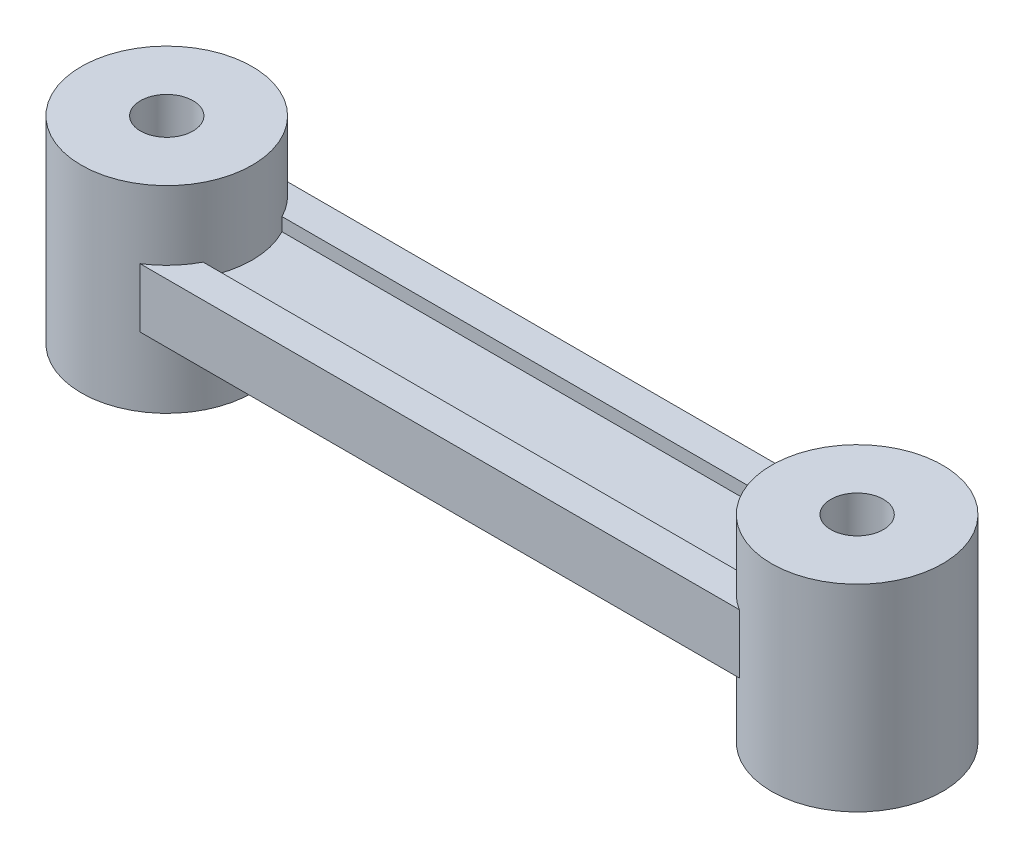
ISO-10303-21;
HEADER;
FILE_DESCRIPTION(('STEP AP214'),'2;1');
FILE_NAME('part.step','',(''),(''),'','','');
FILE_SCHEMA(('AUTOMOTIVE_DESIGN { 1 0 10303 214 1 1 1 1 }'));
ENDSEC;
DATA;
#1=APPLICATION_CONTEXT('core data for automotive mechanical design processes');
#2=APPLICATION_PROTOCOL_DEFINITION('international standard','automotive_design',2000,#1);
#3=PRODUCT_CONTEXT('',#1,'mechanical');
#4=PRODUCT('Part','Part','',(#3));
#5=PRODUCT_RELATED_PRODUCT_CATEGORY('part','',(#4));
#6=PRODUCT_DEFINITION_FORMATION('','',#4);
#7=PRODUCT_DEFINITION_CONTEXT('part definition',#1,'design');
#8=PRODUCT_DEFINITION('design','',#6,#7);
#9=PRODUCT_DEFINITION_SHAPE('','',#8);
#10=(LENGTH_UNIT() NAMED_UNIT(*) SI_UNIT(.MILLI.,.METRE.));
#11=(NAMED_UNIT(*) PLANE_ANGLE_UNIT() SI_UNIT($,.RADIAN.));
#12=(NAMED_UNIT(*) SI_UNIT($,.STERADIAN.) SOLID_ANGLE_UNIT());
#13=UNCERTAINTY_MEASURE_WITH_UNIT(LENGTH_MEASURE(1.E-05),#10,'distance_accuracy_value','');
#14=(GEOMETRIC_REPRESENTATION_CONTEXT(3) GLOBAL_UNCERTAINTY_ASSIGNED_CONTEXT((#13)) GLOBAL_UNIT_ASSIGNED_CONTEXT((#10,
#11,#12)) REPRESENTATION_CONTEXT('',''));
#15=CARTESIAN_POINT('',(0.,0.,0.));
#16=DIRECTION('',(0.,0.,1.));
#17=DIRECTION('',(1.,0.,0.));
#18=AXIS2_PLACEMENT_3D('',#15,#16,#17);
#19=CARTESIAN_POINT('',(-13.,-4.5,0.));
#20=DIRECTION('',(0.,1.,0.));
#21=DIRECTION('',(0.,0.,1.));
#22=AXIS2_PLACEMENT_3D('',#19,#20,#21);
#23=PLANE('',#22);
#24=DIRECTION('',(-1.,0.,0.));
#25=VECTOR('',#24,1.);
#26=CARTESIAN_POINT('',(-106.467437405329,-4.5,-6.));
#27=LINE('',#26,#25);
#28=CARTESIAN_POINT('',(-24.5325625946708,-4.5,-6.));
#29=VERTEX_POINT('',#28);
#30=CARTESIAN_POINT('',(-106.467437405329,-4.5,-6.));
#31=VERTEX_POINT('',#30);
#32=EDGE_CURVE('E149',#29,#31,#27,.T.);
#33=ORIENTED_EDGE('',*,*,#32,.T.);
#34=CARTESIAN_POINT('',(-118.,-4.5,0.));
#35=DIRECTION('',(0.,-1.,0.));
#36=DIRECTION('',(0.,0.,1.));
#37=AXIS2_PLACEMENT_3D('',#34,#35,#36);
#38=CIRCLE('',#37,13.);
#39=CARTESIAN_POINT('',(-111.071796769725,-4.5,-11.));
#40=VERTEX_POINT('',#39);
#41=EDGE_CURVE('E218',#40,#31,#38,.T.);
#42=ORIENTED_EDGE('',*,*,#41,.F.);
#43=DIRECTION('',(-1.,0.,0.));
#44=VECTOR('',#43,1.);
#45=CARTESIAN_POINT('',(-111.071796769725,-4.5,-11.));
#46=LINE('',#45,#44);
#47=CARTESIAN_POINT('',(-19.9282032302755,-4.5,-11.));
#48=VERTEX_POINT('',#47);
#49=EDGE_CURVE('E214',#48,#40,#46,.T.);
#50=ORIENTED_EDGE('',*,*,#49,.F.);
#51=CARTESIAN_POINT('',(-13.,-4.5,0.));
#52=DIRECTION('',(0.,-1.,0.));
#53=DIRECTION('',(0.,0.,1.));
#54=AXIS2_PLACEMENT_3D('',#51,#52,#53);
#55=CIRCLE('',#54,13.);
#56=EDGE_CURVE('E196',#29,#48,#55,.T.);
#57=ORIENTED_EDGE('',*,*,#56,.F.);
#58=EDGE_LOOP('',(#33,#42,#50,#57));
#59=FACE_BOUND('',#58,.T.);
#60=ADVANCED_FACE('F36',(#59),#23,.F.);
#61=DIRECTION('',(1.,0.,0.));
#62=VECTOR('',#61,1.);
#63=CARTESIAN_POINT('',(-106.467437405329,-4.5,6.00000000000002));
#64=LINE('',#63,#62);
#65=CARTESIAN_POINT('',(-106.467437405329,-4.5,6.00000000000003));
#66=VERTEX_POINT('',#65);
#67=CARTESIAN_POINT('',(-24.5325625946708,-4.5,6.00000000000001));
#68=VERTEX_POINT('',#67);
#69=EDGE_CURVE('E152',#66,#68,#64,.T.);
#70=ORIENTED_EDGE('',*,*,#69,.T.);
#71=CARTESIAN_POINT('',(-19.9282032302755,-4.5,11.));
#72=VERTEX_POINT('',#71);
#73=EDGE_CURVE('E145',#72,#68,#55,.T.);
#74=ORIENTED_EDGE('',*,*,#73,.F.);
#75=DIRECTION('',(1.,0.,0.));
#76=VECTOR('',#75,1.);
#77=CARTESIAN_POINT('',(-111.071796769725,-4.5,11.));
#78=LINE('',#77,#76);
#79=CARTESIAN_POINT('',(-111.071796769724,-4.5,11.));
#80=VERTEX_POINT('',#79);
#81=EDGE_CURVE('E221',#80,#72,#78,.T.);
#82=ORIENTED_EDGE('',*,*,#81,.F.);
#83=EDGE_CURVE('E217',#66,#80,#38,.T.);
#84=ORIENTED_EDGE('',*,*,#83,.F.);
#85=EDGE_LOOP('',(#70,#74,#82,#84));
#86=FACE_BOUND('',#85,.T.);
#87=ADVANCED_FACE('F256',(#86),#23,.F.);
#88=CARTESIAN_POINT('',(-13.,4.5,0.));
#89=DIRECTION('',(0.,1.,0.));
#90=DIRECTION('',(0.,0.,1.));
#91=AXIS2_PLACEMENT_3D('',#88,#89,#90);
#92=PLANE('',#91);
#93=DIRECTION('',(1.,0.,0.));
#94=VECTOR('',#93,1.);
#95=CARTESIAN_POINT('',(-106.467437405329,4.5,6.00000000000002));
#96=LINE('',#95,#94);
#97=CARTESIAN_POINT('',(-106.467437405329,4.5,6.00000000000003));
#98=VERTEX_POINT('',#97);
#99=CARTESIAN_POINT('',(-24.5325625946708,4.5,6.00000000000001));
#100=VERTEX_POINT('',#99);
#101=EDGE_CURVE('E59',#98,#100,#96,.T.);
#102=ORIENTED_EDGE('',*,*,#101,.F.);
#103=CARTESIAN_POINT('',(-118.,4.5,0.));
#104=DIRECTION('',(0.,-1.,0.));
#105=DIRECTION('',(0.,0.,1.));
#106=AXIS2_PLACEMENT_3D('',#103,#104,#105);
#107=CIRCLE('',#106,13.);
#108=CARTESIAN_POINT('',(-111.071796769724,4.5,11.));
#109=VERTEX_POINT('',#108);
#110=EDGE_CURVE('E206',#98,#109,#107,.T.);
#111=ORIENTED_EDGE('',*,*,#110,.T.);
#112=DIRECTION('',(1.,0.,0.));
#113=VECTOR('',#112,1.);
#114=CARTESIAN_POINT('',(-111.071796769725,4.5,11.));
#115=LINE('',#114,#113);
#116=CARTESIAN_POINT('',(-19.9282032302755,4.5,11.));
#117=VERTEX_POINT('',#116);
#118=EDGE_CURVE('E210',#109,#117,#115,.T.);
#119=ORIENTED_EDGE('',*,*,#118,.T.);
#120=CARTESIAN_POINT('',(-13.,4.5,0.));
#121=DIRECTION('',(0.,-1.,0.));
#122=DIRECTION('',(0.,0.,1.));
#123=AXIS2_PLACEMENT_3D('',#120,#121,#122);
#124=CIRCLE('',#123,13.);
#125=EDGE_CURVE('E199',#117,#100,#124,.T.);
#126=ORIENTED_EDGE('',*,*,#125,.T.);
#127=EDGE_LOOP('',(#102,#111,#119,#126));
#128=FACE_BOUND('',#127,.T.);
#129=ADVANCED_FACE('F262',(#128),#92,.T.);
#130=CARTESIAN_POINT('',(-118.,15.,0.));
#131=DIRECTION('',(0.,1.,0.));
#132=DIRECTION('',(0.,0.,1.));
#133=AXIS2_PLACEMENT_3D('',#130,#131,#132);
#134=PLANE('',#133);
#135=CARTESIAN_POINT('',(-118.,15.,0.));
#136=DIRECTION('',(0.,1.,0.));
#137=DIRECTION('',(0.,0.,1.));
#138=AXIS2_PLACEMENT_3D('',#135,#136,#137);
#139=CIRCLE('',#138,13.);
#140=CARTESIAN_POINT('',(-118.,15.,13.));
#141=VERTEX_POINT('',#140);
#142=EDGE_CURVE('E11',#141,#141,#139,.T.);
#143=ORIENTED_EDGE('',*,*,#142,.T.);
#144=EDGE_LOOP('',(#143));
#145=FACE_BOUND('',#144,.T.);
#146=CARTESIAN_POINT('',(-118.,15.,0.));
#147=DIRECTION('',(0.,1.,0.));
#148=DIRECTION('',(0.,0.,1.));
#149=AXIS2_PLACEMENT_3D('',#146,#147,#148);
#150=CIRCLE('',#149,4.00000000000001);
#151=CARTESIAN_POINT('',(-118.,15.,4.00000000000002));
#152=VERTEX_POINT('',#151);
#153=EDGE_CURVE('E233',#152,#152,#150,.T.);
#154=ORIENTED_EDGE('',*,*,#153,.F.);
#155=EDGE_LOOP('',(#154));
#156=FACE_BOUND('',#155,.T.);
#157=ADVANCED_FACE('F347',(#145,#156),#134,.T.);
#158=CARTESIAN_POINT('',(-118.,-15.,0.));
#159=DIRECTION('',(0.,1.,0.));
#160=DIRECTION('',(0.,0.,1.));
#161=AXIS2_PLACEMENT_3D('',#158,#159,#160);
#162=PLANE('',#161);
#163=CARTESIAN_POINT('',(-118.,-15.,0.));
#164=DIRECTION('',(0.,1.,0.));
#165=DIRECTION('',(0.,0.,1.));
#166=AXIS2_PLACEMENT_3D('',#163,#164,#165);
#167=CIRCLE('',#166,13.);
#168=CARTESIAN_POINT('',(-118.,-15.,13.));
#169=VERTEX_POINT('',#168);
#170=EDGE_CURVE('E40',#169,#169,#167,.T.);
#171=ORIENTED_EDGE('',*,*,#170,.F.);
#172=EDGE_LOOP('',(#171));
#173=FACE_BOUND('',#172,.T.);
#174=CARTESIAN_POINT('',(-118.,-15.,0.));
#175=DIRECTION('',(0.,1.,0.));
#176=DIRECTION('',(0.,0.,1.));
#177=AXIS2_PLACEMENT_3D('',#174,#175,#176);
#178=CIRCLE('',#177,4.00000000000001);
#179=CARTESIAN_POINT('',(-118.,-15.,4.00000000000002));
#180=VERTEX_POINT('',#179);
#181=EDGE_CURVE('E232',#180,#180,#178,.T.);
#182=ORIENTED_EDGE('',*,*,#181,.T.);
#183=EDGE_LOOP('',(#182));
#184=FACE_BOUND('',#183,.T.);
#185=ADVANCED_FACE('F239',(#173,#184),#162,.F.);
#186=CARTESIAN_POINT('',(-118.,15.,0.));
#187=DIRECTION('',(0.,-1.,0.));
#188=DIRECTION('',(0.,0.,-1.));
#189=AXIS2_PLACEMENT_3D('',#186,#187,#188);
#190=CYLINDRICAL_SURFACE('',#189,13.);
#191=DIRECTION('',(0.,-1.,0.));
#192=VECTOR('',#191,1.);
#193=CARTESIAN_POINT('',(-111.071796769725,4.5,11.));
#194=LINE('',#193,#192);
#195=EDGE_CURVE('E224',#109,#80,#194,.T.);
#196=ORIENTED_EDGE('',*,*,#195,.F.);
#197=ORIENTED_EDGE('',*,*,#110,.F.);
#198=DIRECTION('',(0.,1.,0.));
#199=VECTOR('',#198,1.);
#200=CARTESIAN_POINT('',(-106.467437405329,2.5,6.00000000000003));
#201=LINE('',#200,#199);
#202=CARTESIAN_POINT('',(-106.467437405329,2.5,6.00000000000003));
#203=VERTEX_POINT('',#202);
#204=EDGE_CURVE('E182',#203,#98,#201,.T.);
#205=ORIENTED_EDGE('',*,*,#204,.F.);
#206=CARTESIAN_POINT('',(-118.,2.5,0.));
#207=DIRECTION('',(0.,-1.,0.));
#208=DIRECTION('',(0.,0.,1.));
#209=AXIS2_PLACEMENT_3D('',#206,#207,#208);
#210=CIRCLE('',#209,13.);
#211=CARTESIAN_POINT('',(-106.467437405329,2.5,-6.));
#212=VERTEX_POINT('',#211);
#213=EDGE_CURVE('E169',#212,#203,#210,.T.);
#214=ORIENTED_EDGE('',*,*,#213,.F.);
#215=DIRECTION('',(0.,1.,0.));
#216=VECTOR('',#215,1.);
#217=CARTESIAN_POINT('',(-106.467437405329,2.5,-6.));
#218=LINE('',#217,#216);
#219=CARTESIAN_POINT('',(-106.467437405329,4.5,-6.));
#220=VERTEX_POINT('',#219);
#221=EDGE_CURVE('E184',#212,#220,#218,.T.);
#222=ORIENTED_EDGE('',*,*,#221,.T.);
#223=CARTESIAN_POINT('',(-111.071796769725,4.5,-11.));
#224=VERTEX_POINT('',#223);
#225=EDGE_CURVE('E207',#224,#220,#107,.T.);
#226=ORIENTED_EDGE('',*,*,#225,.F.);
#227=DIRECTION('',(0.,-1.,0.));
#228=VECTOR('',#227,1.);
#229=CARTESIAN_POINT('',(-111.071796769725,4.5,-11.));
#230=LINE('',#229,#228);
#231=EDGE_CURVE('E227',#224,#40,#230,.T.);
#232=ORIENTED_EDGE('',*,*,#231,.T.);
#233=ORIENTED_EDGE('',*,*,#41,.T.);
#234=DIRECTION('',(0.,-1.,0.));
#235=VECTOR('',#234,1.);
#236=CARTESIAN_POINT('',(-106.467437405329,-2.5,-6.));
#237=LINE('',#236,#235);
#238=CARTESIAN_POINT('',(-106.467437405329,-2.5,-6.));
#239=VERTEX_POINT('',#238);
#240=EDGE_CURVE('E160',#239,#31,#237,.T.);
#241=ORIENTED_EDGE('',*,*,#240,.F.);
#242=CARTESIAN_POINT('',(-118.,-2.5,0.));
#243=DIRECTION('',(0.,-1.,0.));
#244=DIRECTION('',(0.,0.,1.));
#245=AXIS2_PLACEMENT_3D('',#242,#243,#244);
#246=CIRCLE('',#245,13.);
#247=CARTESIAN_POINT('',(-106.467437405329,-2.5,6.00000000000003));
#248=VERTEX_POINT('',#247);
#249=EDGE_CURVE('E136',#239,#248,#246,.T.);
#250=ORIENTED_EDGE('',*,*,#249,.T.);
#251=DIRECTION('',(0.,-1.,0.));
#252=VECTOR('',#251,1.);
#253=CARTESIAN_POINT('',(-106.467437405329,-2.5,6.00000000000003));
#254=LINE('',#253,#252);
#255=EDGE_CURVE('E132',#248,#66,#254,.T.);
#256=ORIENTED_EDGE('',*,*,#255,.T.);
#257=ORIENTED_EDGE('',*,*,#83,.T.);
#258=EDGE_LOOP('',(#196,#197,#205,#214,#222,#226,#232,#233,#241,#250,#256,#257));
#259=FACE_BOUND('',#258,.T.);
#260=ORIENTED_EDGE('',*,*,#142,.F.);
#261=EDGE_LOOP('',(#260));
#262=FACE_BOUND('',#261,.T.);
#263=ORIENTED_EDGE('',*,*,#170,.T.);
#264=EDGE_LOOP('',(#263));
#265=FACE_BOUND('',#264,.T.);
#266=ADVANCED_FACE('F38',(#259,#262,#265),#190,.T.);
#267=CARTESIAN_POINT('',(-118.,15.,0.));
#268=DIRECTION('',(0.,-1.,0.));
#269=DIRECTION('',(0.,0.,-1.));
#270=AXIS2_PLACEMENT_3D('',#267,#268,#269);
#271=CYLINDRICAL_SURFACE('',#270,4.00000000000001);
#272=ORIENTED_EDGE('',*,*,#153,.T.);
#273=EDGE_LOOP('',(#272));
#274=FACE_BOUND('',#273,.T.);
#275=ORIENTED_EDGE('',*,*,#181,.F.);
#276=EDGE_LOOP('',(#275));
#277=FACE_BOUND('',#276,.T.);
#278=ADVANCED_FACE('F241',(#274,#277),#271,.F.);
#279=CARTESIAN_POINT('',(-111.071796769725,4.5,-11.));
#280=DIRECTION('',(0.,0.,1.));
#281=DIRECTION('',(1.,0.,0.));
#282=AXIS2_PLACEMENT_3D('',#279,#280,#281);
#283=PLANE('',#282);
#284=ORIENTED_EDGE('',*,*,#49,.T.);
#285=ORIENTED_EDGE('',*,*,#231,.F.);
#286=DIRECTION('',(-1.,0.,0.));
#287=VECTOR('',#286,1.);
#288=CARTESIAN_POINT('',(-111.071796769725,4.5,-11.));
#289=LINE('',#288,#287);
#290=CARTESIAN_POINT('',(-19.9282032302755,4.5,-11.));
#291=VERTEX_POINT('',#290);
#292=EDGE_CURVE('E202',#291,#224,#289,.T.);
#293=ORIENTED_EDGE('',*,*,#292,.F.);
#294=DIRECTION('',(0.,-1.,0.));
#295=VECTOR('',#294,1.);
#296=CARTESIAN_POINT('',(-19.9282032302755,4.5,-11.));
#297=LINE('',#296,#295);
#298=EDGE_CURVE('E229',#291,#48,#297,.T.);
#299=ORIENTED_EDGE('',*,*,#298,.T.);
#300=EDGE_LOOP('',(#284,#285,#293,#299));
#301=FACE_BOUND('',#300,.T.);
#302=ADVANCED_FACE('F243',(#301),#283,.F.);
#303=CARTESIAN_POINT('',(-111.071796769725,4.5,11.));
#304=DIRECTION('',(0.,0.,-1.));
#305=DIRECTION('',(-1.,0.,0.));
#306=AXIS2_PLACEMENT_3D('',#303,#304,#305);
#307=PLANE('',#306);
#308=ORIENTED_EDGE('',*,*,#81,.T.);
#309=DIRECTION('',(0.,-1.,0.));
#310=VECTOR('',#309,1.);
#311=CARTESIAN_POINT('',(-19.9282032302755,4.5,11.));
#312=LINE('',#311,#310);
#313=EDGE_CURVE('E212',#117,#72,#312,.T.);
#314=ORIENTED_EDGE('',*,*,#313,.F.);
#315=ORIENTED_EDGE('',*,*,#118,.F.);
#316=ORIENTED_EDGE('',*,*,#195,.T.);
#317=EDGE_LOOP('',(#308,#314,#315,#316));
#318=FACE_BOUND('',#317,.T.);
#319=ADVANCED_FACE('F250',(#318),#307,.F.);
#320=DIRECTION('',(-1.,0.,0.));
#321=VECTOR('',#320,1.);
#322=CARTESIAN_POINT('',(-106.467437405329,4.5,-6.));
#323=LINE('',#322,#321);
#324=CARTESIAN_POINT('',(-24.5325625946708,4.5,-6.));
#325=VERTEX_POINT('',#324);
#326=EDGE_CURVE('E159',#325,#220,#323,.T.);
#327=ORIENTED_EDGE('',*,*,#326,.F.);
#328=EDGE_CURVE('E203',#325,#291,#124,.T.);
#329=ORIENTED_EDGE('',*,*,#328,.T.);
#330=ORIENTED_EDGE('',*,*,#292,.T.);
#331=ORIENTED_EDGE('',*,*,#225,.T.);
#332=EDGE_LOOP('',(#327,#329,#330,#331));
#333=FACE_BOUND('',#332,.T.);
#334=ADVANCED_FACE('F266',(#333),#92,.T.);
#335=CARTESIAN_POINT('',(-13.,15.,0.));
#336=DIRECTION('',(0.,1.,0.));
#337=DIRECTION('',(0.,0.,1.));
#338=AXIS2_PLACEMENT_3D('',#335,#336,#337);
#339=PLANE('',#338);
#340=CARTESIAN_POINT('',(-13.,15.,0.));
#341=DIRECTION('',(0.,1.,0.));
#342=DIRECTION('',(0.,0.,1.));
#343=AXIS2_PLACEMENT_3D('',#340,#341,#342);
#344=CIRCLE('',#343,13.);
#345=CARTESIAN_POINT('',(-13.,15.,13.));
#346=VERTEX_POINT('',#345);
#347=EDGE_CURVE('E193',#346,#346,#344,.T.);
#348=ORIENTED_EDGE('',*,*,#347,.T.);
#349=EDGE_LOOP('',(#348));
#350=FACE_BOUND('',#349,.T.);
#351=CARTESIAN_POINT('',(-13.,15.,0.));
#352=DIRECTION('',(0.,1.,0.));
#353=DIRECTION('',(0.,0.,1.));
#354=AXIS2_PLACEMENT_3D('',#351,#352,#353);
#355=CIRCLE('',#354,4.);
#356=CARTESIAN_POINT('',(-13.,15.,4.));
#357=VERTEX_POINT('',#356);
#358=EDGE_CURVE('E187',#357,#357,#355,.T.);
#359=ORIENTED_EDGE('',*,*,#358,.F.);
#360=EDGE_LOOP('',(#359));
#361=FACE_BOUND('',#360,.T.);
#362=ADVANCED_FACE('F273',(#350,#361),#339,.T.);
#363=CARTESIAN_POINT('',(-13.,-15.,0.));
#364=DIRECTION('',(0.,1.,0.));
#365=DIRECTION('',(0.,0.,1.));
#366=AXIS2_PLACEMENT_3D('',#363,#364,#365);
#367=PLANE('',#366);
#368=CARTESIAN_POINT('',(-13.,-15.,0.));
#369=DIRECTION('',(0.,1.,0.));
#370=DIRECTION('',(0.,0.,1.));
#371=AXIS2_PLACEMENT_3D('',#368,#369,#370);
#372=CIRCLE('',#371,13.);
#373=CARTESIAN_POINT('',(-13.,-15.,13.));
#374=VERTEX_POINT('',#373);
#375=EDGE_CURVE('E190',#374,#374,#372,.T.);
#376=ORIENTED_EDGE('',*,*,#375,.F.);
#377=EDGE_LOOP('',(#376));
#378=FACE_BOUND('',#377,.T.);
#379=CARTESIAN_POINT('',(-13.,-15.,0.));
#380=DIRECTION('',(0.,1.,0.));
#381=DIRECTION('',(0.,0.,1.));
#382=AXIS2_PLACEMENT_3D('',#379,#380,#381);
#383=CIRCLE('',#382,4.);
#384=CARTESIAN_POINT('',(-13.,-15.,4.));
#385=VERTEX_POINT('',#384);
#386=EDGE_CURVE('E181',#385,#385,#383,.T.);
#387=ORIENTED_EDGE('',*,*,#386,.T.);
#388=EDGE_LOOP('',(#387));
#389=FACE_BOUND('',#388,.T.);
#390=ADVANCED_FACE('F318',(#378,#389),#367,.F.);
#391=CARTESIAN_POINT('',(-13.,15.,0.));
#392=DIRECTION('',(0.,-1.,0.));
#393=DIRECTION('',(0.,0.,-1.));
#394=AXIS2_PLACEMENT_3D('',#391,#392,#393);
#395=CYLINDRICAL_SURFACE('',#394,13.);
#396=ORIENTED_EDGE('',*,*,#125,.F.);
#397=ORIENTED_EDGE('',*,*,#313,.T.);
#398=ORIENTED_EDGE('',*,*,#73,.T.);
#399=DIRECTION('',(0.,-1.,0.));
#400=VECTOR('',#399,1.);
#401=CARTESIAN_POINT('',(-24.5325625946708,-2.5,6.00000000000001));
#402=LINE('',#401,#400);
#403=CARTESIAN_POINT('',(-24.5325625946708,-2.5,6.00000000000001));
#404=VERTEX_POINT('',#403);
#405=EDGE_CURVE('E130',#404,#68,#402,.T.);
#406=ORIENTED_EDGE('',*,*,#405,.F.);
#407=CARTESIAN_POINT('',(-13.,-2.5,0.));
#408=DIRECTION('',(0.,-1.,0.));
#409=DIRECTION('',(0.,0.,1.));
#410=AXIS2_PLACEMENT_3D('',#407,#408,#409);
#411=CIRCLE('',#410,13.);
#412=CARTESIAN_POINT('',(-24.5325625946708,-2.5,-6.));
#413=VERTEX_POINT('',#412);
#414=EDGE_CURVE('E137',#404,#413,#411,.T.);
#415=ORIENTED_EDGE('',*,*,#414,.T.);
#416=DIRECTION('',(0.,-1.,0.));
#417=VECTOR('',#416,1.);
#418=CARTESIAN_POINT('',(-24.5325625946708,-2.5,-6.));
#419=LINE('',#418,#417);
#420=EDGE_CURVE('E51',#413,#29,#419,.T.);
#421=ORIENTED_EDGE('',*,*,#420,.T.);
#422=ORIENTED_EDGE('',*,*,#56,.T.);
#423=ORIENTED_EDGE('',*,*,#298,.F.);
#424=ORIENTED_EDGE('',*,*,#328,.F.);
#425=DIRECTION('',(0.,1.,0.));
#426=VECTOR('',#425,1.);
#427=CARTESIAN_POINT('',(-24.5325625946708,2.5,-6.));
#428=LINE('',#427,#426);
#429=CARTESIAN_POINT('',(-24.5325625946708,2.5,-6.));
#430=VERTEX_POINT('',#429);
#431=EDGE_CURVE('E175',#430,#325,#428,.T.);
#432=ORIENTED_EDGE('',*,*,#431,.F.);
#433=CARTESIAN_POINT('',(-13.,2.5,0.));
#434=DIRECTION('',(0.,-1.,0.));
#435=DIRECTION('',(0.,0.,1.));
#436=AXIS2_PLACEMENT_3D('',#433,#434,#435);
#437=CIRCLE('',#436,13.);
#438=CARTESIAN_POINT('',(-24.5325625946708,2.5,6.00000000000001));
#439=VERTEX_POINT('',#438);
#440=EDGE_CURVE('E163',#439,#430,#437,.T.);
#441=ORIENTED_EDGE('',*,*,#440,.F.);
#442=DIRECTION('',(0.,1.,0.));
#443=VECTOR('',#442,1.);
#444=CARTESIAN_POINT('',(-24.5325625946708,2.5,6.00000000000001));
#445=LINE('',#444,#443);
#446=EDGE_CURVE('E179',#439,#100,#445,.T.);
#447=ORIENTED_EDGE('',*,*,#446,.T.);
#448=EDGE_LOOP('',(#396,#397,#398,#406,#415,#421,#422,#423,#424,#432,#441,#447));
#449=FACE_BOUND('',#448,.T.);
#450=ORIENTED_EDGE('',*,*,#347,.F.);
#451=EDGE_LOOP('',(#450));
#452=FACE_BOUND('',#451,.T.);
#453=ORIENTED_EDGE('',*,*,#375,.T.);
#454=EDGE_LOOP('',(#453));
#455=FACE_BOUND('',#454,.T.);
#456=ADVANCED_FACE('F141',(#449,#452,#455),#395,.T.);
#457=CARTESIAN_POINT('',(-13.,15.,0.));
#458=DIRECTION('',(0.,-1.,0.));
#459=DIRECTION('',(0.,0.,-1.));
#460=AXIS2_PLACEMENT_3D('',#457,#458,#459);
#461=CYLINDRICAL_SURFACE('',#460,4.);
#462=ORIENTED_EDGE('',*,*,#358,.T.);
#463=EDGE_LOOP('',(#462));
#464=FACE_BOUND('',#463,.T.);
#465=ORIENTED_EDGE('',*,*,#386,.F.);
#466=EDGE_LOOP('',(#465));
#467=FACE_BOUND('',#466,.T.);
#468=ADVANCED_FACE('F304',(#464,#467),#461,.F.);
#469=CARTESIAN_POINT('',(-106.467437405329,2.5,6.00000000000002));
#470=DIRECTION('',(0.,0.,1.));
#471=DIRECTION('',(1.,0.,0.));
#472=AXIS2_PLACEMENT_3D('',#469,#470,#471);
#473=PLANE('',#472);
#474=ORIENTED_EDGE('',*,*,#101,.T.);
#475=ORIENTED_EDGE('',*,*,#446,.F.);
#476=DIRECTION('',(1.,0.,0.));
#477=VECTOR('',#476,1.);
#478=CARTESIAN_POINT('',(-106.467437405329,2.5,6.00000000000002));
#479=LINE('',#478,#477);
#480=EDGE_CURVE('E172',#203,#439,#479,.T.);
#481=ORIENTED_EDGE('',*,*,#480,.F.);
#482=ORIENTED_EDGE('',*,*,#204,.T.);
#483=EDGE_LOOP('',(#474,#475,#481,#482));
#484=FACE_BOUND('',#483,.T.);
#485=ADVANCED_FACE('F302',(#484),#473,.F.);
#486=CARTESIAN_POINT('',(-106.467437405329,2.5,-6.));
#487=DIRECTION('',(0.,0.,-1.));
#488=DIRECTION('',(-1.,0.,0.));
#489=AXIS2_PLACEMENT_3D('',#486,#487,#488);
#490=PLANE('',#489);
#491=ORIENTED_EDGE('',*,*,#326,.T.);
#492=ORIENTED_EDGE('',*,*,#221,.F.);
#493=DIRECTION('',(-1.,0.,0.));
#494=VECTOR('',#493,1.);
#495=CARTESIAN_POINT('',(-106.467437405329,2.5,-6.));
#496=LINE('',#495,#494);
#497=EDGE_CURVE('E166',#430,#212,#496,.T.);
#498=ORIENTED_EDGE('',*,*,#497,.F.);
#499=ORIENTED_EDGE('',*,*,#431,.T.);
#500=EDGE_LOOP('',(#491,#492,#498,#499));
#501=FACE_BOUND('',#500,.T.);
#502=ADVANCED_FACE('F297',(#501),#490,.F.);
#503=CARTESIAN_POINT('',(-13.,2.5,0.));
#504=DIRECTION('',(0.,1.,0.));
#505=DIRECTION('',(0.,0.,1.));
#506=AXIS2_PLACEMENT_3D('',#503,#504,#505);
#507=PLANE('',#506);
#508=ORIENTED_EDGE('',*,*,#440,.T.);
#509=ORIENTED_EDGE('',*,*,#497,.T.);
#510=ORIENTED_EDGE('',*,*,#213,.T.);
#511=ORIENTED_EDGE('',*,*,#480,.T.);
#512=EDGE_LOOP('',(#508,#509,#510,#511));
#513=FACE_BOUND('',#512,.T.);
#514=ADVANCED_FACE('F300',(#513),#507,.T.);
#515=CARTESIAN_POINT('',(-106.467437405329,-2.5,-6.));
#516=DIRECTION('',(0.,0.,1.));
#517=DIRECTION('',(1.,0.,0.));
#518=AXIS2_PLACEMENT_3D('',#515,#516,#517);
#519=PLANE('',#518);
#520=ORIENTED_EDGE('',*,*,#32,.F.);
#521=ORIENTED_EDGE('',*,*,#420,.F.);
#522=DIRECTION('',(-1.,0.,0.));
#523=VECTOR('',#522,1.);
#524=CARTESIAN_POINT('',(-106.467437405329,-2.5,-6.));
#525=LINE('',#524,#523);
#526=EDGE_CURVE('E146',#413,#239,#525,.T.);
#527=ORIENTED_EDGE('',*,*,#526,.T.);
#528=ORIENTED_EDGE('',*,*,#240,.T.);
#529=EDGE_LOOP('',(#520,#521,#527,#528));
#530=FACE_BOUND('',#529,.T.);
#531=ADVANCED_FACE('F287',(#530),#519,.T.);
#532=CARTESIAN_POINT('',(-106.467437405329,-2.5,6.00000000000002));
#533=DIRECTION('',(0.,0.,-1.));
#534=DIRECTION('',(-1.,0.,0.));
#535=AXIS2_PLACEMENT_3D('',#532,#533,#534);
#536=PLANE('',#535);
#537=ORIENTED_EDGE('',*,*,#69,.F.);
#538=ORIENTED_EDGE('',*,*,#255,.F.);
#539=DIRECTION('',(1.,0.,0.));
#540=VECTOR('',#539,1.);
#541=CARTESIAN_POINT('',(-106.467437405329,-2.5,6.00000000000002));
#542=LINE('',#541,#540);
#543=EDGE_CURVE('E126',#248,#404,#542,.T.);
#544=ORIENTED_EDGE('',*,*,#543,.T.);
#545=ORIENTED_EDGE('',*,*,#405,.T.);
#546=EDGE_LOOP('',(#537,#538,#544,#545));
#547=FACE_BOUND('',#546,.T.);
#548=ADVANCED_FACE('F129',(#547),#536,.T.);
#549=CARTESIAN_POINT('',(-13.,-2.5,0.));
#550=DIRECTION('',(0.,-1.,0.));
#551=DIRECTION('',(0.,0.,1.));
#552=AXIS2_PLACEMENT_3D('',#549,#550,#551);
#553=PLANE('',#552);
#554=ORIENTED_EDGE('',*,*,#414,.F.);
#555=ORIENTED_EDGE('',*,*,#543,.F.);
#556=ORIENTED_EDGE('',*,*,#249,.F.);
#557=ORIENTED_EDGE('',*,*,#526,.F.);
#558=EDGE_LOOP('',(#554,#555,#556,#557));
#559=FACE_BOUND('',#558,.T.);
#560=ADVANCED_FACE('F148',(#559),#553,.T.);
#561=CLOSED_SHELL('',(#60,#87,#129,#157,#185,#266,#278,#302,#319,#334,#362,#390,#456,#468,#485,
#502,#514,#531,#548,#560));
#562=MANIFOLD_SOLID_BREP('B2',#561);
#563=ADVANCED_BREP_SHAPE_REPRESENTATION('',(#18,#562),#14);
#564=SHAPE_DEFINITION_REPRESENTATION(#9,#563);
ENDSEC;
END-ISO-10303-21;
